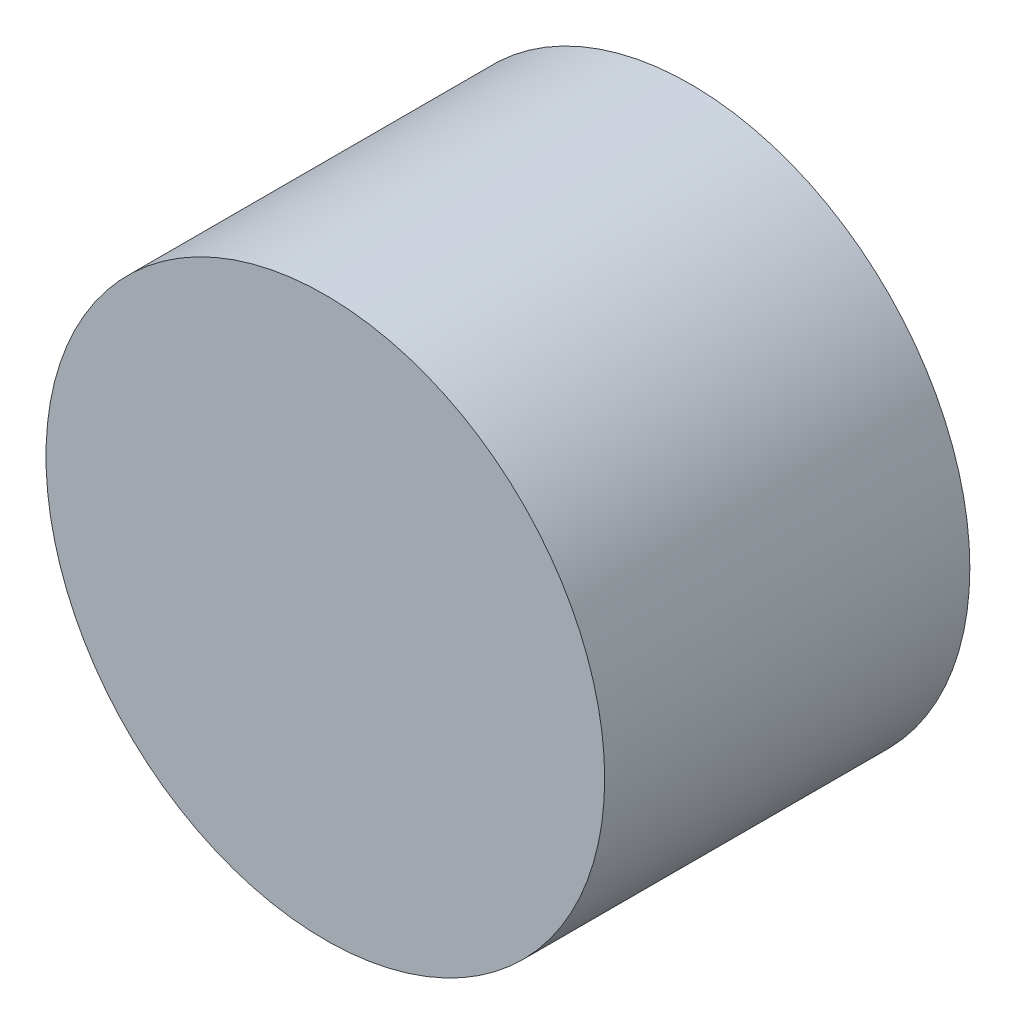
ISO-10303-21;
HEADER;
FILE_DESCRIPTION(('STEP AP214'),'2;1');
FILE_NAME('part.step','',(''),(''),'','','');
FILE_SCHEMA(('AUTOMOTIVE_DESIGN { 1 0 10303 214 1 1 1 1 }'));
ENDSEC;
DATA;
#1=APPLICATION_CONTEXT('core data for automotive mechanical design processes');
#2=APPLICATION_PROTOCOL_DEFINITION('international standard','automotive_design',2000,#1);
#3=PRODUCT_CONTEXT('',#1,'mechanical');
#4=PRODUCT('Part','Part','',(#3));
#5=PRODUCT_RELATED_PRODUCT_CATEGORY('part','',(#4));
#6=PRODUCT_DEFINITION_FORMATION('','',#4);
#7=PRODUCT_DEFINITION_CONTEXT('part definition',#1,'design');
#8=PRODUCT_DEFINITION('design','',#6,#7);
#9=PRODUCT_DEFINITION_SHAPE('','',#8);
#10=(LENGTH_UNIT() NAMED_UNIT(*) SI_UNIT(.MILLI.,.METRE.));
#11=(NAMED_UNIT(*) PLANE_ANGLE_UNIT() SI_UNIT($,.RADIAN.));
#12=(NAMED_UNIT(*) SI_UNIT($,.STERADIAN.) SOLID_ANGLE_UNIT());
#13=UNCERTAINTY_MEASURE_WITH_UNIT(LENGTH_MEASURE(1.E-05),#10,'distance_accuracy_value','');
#14=(GEOMETRIC_REPRESENTATION_CONTEXT(3) GLOBAL_UNCERTAINTY_ASSIGNED_CONTEXT((#13)) GLOBAL_UNIT_ASSIGNED_CONTEXT((#10,
#11,#12)) REPRESENTATION_CONTEXT('',''));
#15=CARTESIAN_POINT('',(0.,0.,0.));
#16=DIRECTION('',(0.,0.,1.));
#17=DIRECTION('',(1.,0.,0.));
#18=AXIS2_PLACEMENT_3D('',#15,#16,#17);
#19=CARTESIAN_POINT('',(0.,0.,45.75));
#20=DIRECTION('',(0.,0.,-1.));
#21=DIRECTION('',(-1.,0.,0.));
#22=AXIS2_PLACEMENT_3D('',#19,#20,#21);
#23=CYLINDRICAL_SURFACE('',#22,35.);
#24=CARTESIAN_POINT('',(0.,0.,45.75));
#25=DIRECTION('',(0.,0.,1.));
#26=DIRECTION('',(1.,0.,0.));
#27=AXIS2_PLACEMENT_3D('',#24,#25,#26);
#28=CIRCLE('',#27,35.);
#29=CARTESIAN_POINT('',(35.,0.,45.75));
#30=VERTEX_POINT('',#29);
#31=EDGE_CURVE('E10',#30,#30,#28,.T.);
#32=ORIENTED_EDGE('',*,*,#31,.F.);
#33=EDGE_LOOP('',(#32));
#34=FACE_BOUND('',#33,.T.);
#35=CARTESIAN_POINT('',(0.,0.,0.));
#36=DIRECTION('',(0.,0.,1.));
#37=DIRECTION('',(1.,0.,0.));
#38=AXIS2_PLACEMENT_3D('',#35,#36,#37);
#39=CIRCLE('',#38,35.);
#40=CARTESIAN_POINT('',(35.,0.,0.));
#41=VERTEX_POINT('',#40);
#42=EDGE_CURVE('E38',#41,#41,#39,.T.);
#43=ORIENTED_EDGE('',*,*,#42,.T.);
#44=EDGE_LOOP('',(#43));
#45=FACE_BOUND('',#44,.T.);
#46=ADVANCED_FACE('F35',(#34,#45),#23,.T.);
#47=CARTESIAN_POINT('',(0.,0.,45.75));
#48=DIRECTION('',(0.,0.,1.));
#49=DIRECTION('',(1.,0.,0.));
#50=AXIS2_PLACEMENT_3D('',#47,#48,#49);
#51=PLANE('',#50);
#52=ORIENTED_EDGE('',*,*,#31,.T.);
#53=EDGE_LOOP('',(#52));
#54=FACE_BOUND('',#53,.T.);
#55=ADVANCED_FACE('F50',(#54),#51,.T.);
#56=CARTESIAN_POINT('',(0.,0.,0.));
#57=DIRECTION('',(0.,0.,1.));
#58=DIRECTION('',(1.,0.,0.));
#59=AXIS2_PLACEMENT_3D('',#56,#57,#58);
#60=PLANE('',#59);
#61=ORIENTED_EDGE('',*,*,#42,.F.);
#62=EDGE_LOOP('',(#61));
#63=FACE_BOUND('',#62,.T.);
#64=ADVANCED_FACE('F48',(#63),#60,.F.);
#65=CLOSED_SHELL('',(#46,#55,#64));
#66=MANIFOLD_SOLID_BREP('B2',#65);
#67=ADVANCED_BREP_SHAPE_REPRESENTATION('',(#18,#66),#14);
#68=SHAPE_DEFINITION_REPRESENTATION(#9,#67);
ENDSEC;
END-ISO-10303-21;
